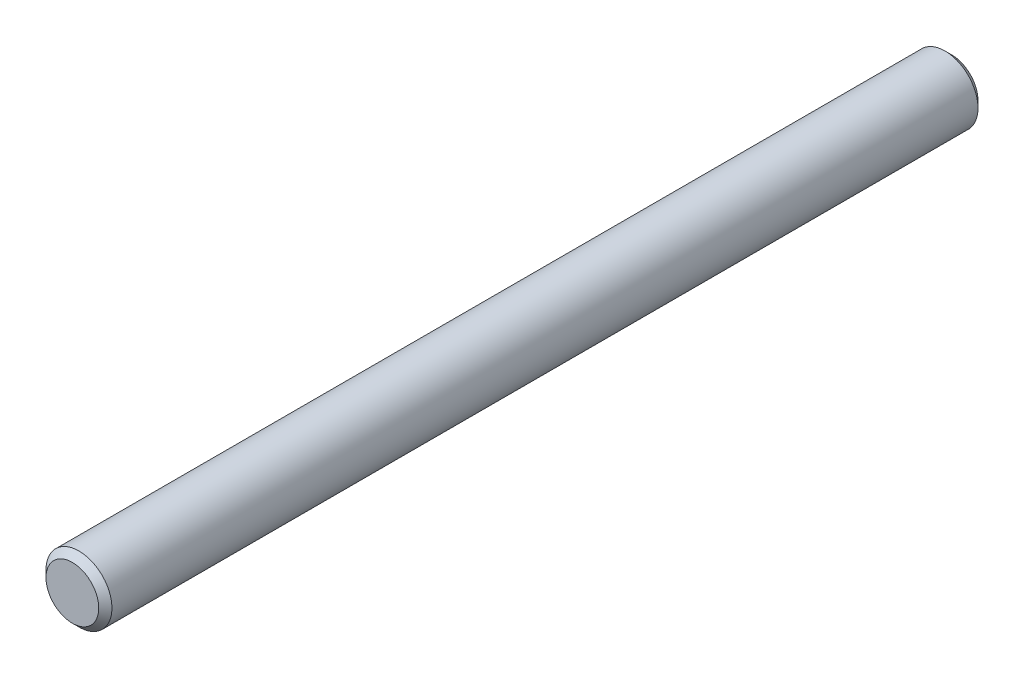
ISO-10303-21;
HEADER;
FILE_DESCRIPTION(('STEP AP214'),'2;1');
FILE_NAME('part.step','',(''),(''),'','','');
FILE_SCHEMA(('AUTOMOTIVE_DESIGN { 1 0 10303 214 1 1 1 1 }'));
ENDSEC;
DATA;
#1=APPLICATION_CONTEXT('core data for automotive mechanical design processes');
#2=APPLICATION_PROTOCOL_DEFINITION('international standard','automotive_design',2000,#1);
#3=PRODUCT_CONTEXT('',#1,'mechanical');
#4=PRODUCT('Part','Part','',(#3));
#5=PRODUCT_RELATED_PRODUCT_CATEGORY('part','',(#4));
#6=PRODUCT_DEFINITION_FORMATION('','',#4);
#7=PRODUCT_DEFINITION_CONTEXT('part definition',#1,'design');
#8=PRODUCT_DEFINITION('design','',#6,#7);
#9=PRODUCT_DEFINITION_SHAPE('','',#8);
#10=(LENGTH_UNIT() NAMED_UNIT(*) SI_UNIT(.MILLI.,.METRE.));
#11=(NAMED_UNIT(*) PLANE_ANGLE_UNIT() SI_UNIT($,.RADIAN.));
#12=(NAMED_UNIT(*) SI_UNIT($,.STERADIAN.) SOLID_ANGLE_UNIT());
#13=UNCERTAINTY_MEASURE_WITH_UNIT(LENGTH_MEASURE(1.E-05),#10,'distance_accuracy_value','');
#14=(GEOMETRIC_REPRESENTATION_CONTEXT(3) GLOBAL_UNCERTAINTY_ASSIGNED_CONTEXT((#13)) GLOBAL_UNIT_ASSIGNED_CONTEXT((#10,
#11,#12)) REPRESENTATION_CONTEXT('',''));
#15=CARTESIAN_POINT('',(0.,0.,0.));
#16=DIRECTION('',(0.,0.,1.));
#17=DIRECTION('',(1.,0.,0.));
#18=AXIS2_PLACEMENT_3D('',#15,#16,#17);
#19=CARTESIAN_POINT('',(0.,0.,63.5));
#20=DIRECTION('',(0.,0.,-1.));
#21=DIRECTION('',(-1.,0.,0.));
#22=AXIS2_PLACEMENT_3D('',#19,#20,#21);
#23=CYLINDRICAL_SURFACE('',#22,4.7625);
#24=CARTESIAN_POINT('',(0.,0.,-62.5475));
#25=DIRECTION('',(0.,0.,1.));
#26=DIRECTION('',(1.,0.,0.));
#27=AXIS2_PLACEMENT_3D('',#24,#25,#26);
#28=CIRCLE('',#27,4.7625);
#29=CARTESIAN_POINT('',(-4.7625,0.,-62.5475));
#30=VERTEX_POINT('',#29);
#31=EDGE_CURVE('E50',#30,#30,#28,.T.);
#32=CARTESIAN_POINT('',(0.,0.,62.5475));
#33=DIRECTION('',(0.,0.,1.));
#34=DIRECTION('',(1.,0.,0.));
#35=AXIS2_PLACEMENT_3D('',#32,#33,#34);
#36=CIRCLE('',#35,4.7625);
#37=CARTESIAN_POINT('',(-4.7625,0.,62.5475));
#38=VERTEX_POINT('',#37);
#39=EDGE_CURVE('E55',#38,#38,#36,.F.);
#40=CARTESIAN_POINT('',(-4.7625,0.,-62.5475));
#41=CARTESIAN_POINT('',(-4.7625,0.,-61.2444270833333));
#42=CARTESIAN_POINT('',(-4.7625,0.,-59.9413541666666));
#43=CARTESIAN_POINT('',(-4.7625,0.,-57.3352083333333));
#44=CARTESIAN_POINT('',(-4.7625,0.,-56.0321354166666));
#45=CARTESIAN_POINT('',(-4.7625,0.,-53.4259895833333));
#46=CARTESIAN_POINT('',(-4.7625,0.,-52.1229166666666));
#47=CARTESIAN_POINT('',(-4.7625,0.,-49.5167708333333));
#48=CARTESIAN_POINT('',(-4.7625,0.,-48.2136979166667));
#49=CARTESIAN_POINT('',(-4.7625,0.,-45.6075520833333));
#50=CARTESIAN_POINT('',(-4.7625,0.,-44.3044791666667));
#51=CARTESIAN_POINT('',(-4.7625,0.,-41.6983333333333));
#52=CARTESIAN_POINT('',(-4.7625,0.,-40.3952604166667));
#53=CARTESIAN_POINT('',(-4.7625,0.,-37.7891145833333));
#54=CARTESIAN_POINT('',(-4.7625,0.,-36.4860416666667));
#55=CARTESIAN_POINT('',(-4.7625,0.,-33.8798958333333));
#56=CARTESIAN_POINT('',(-4.7625,0.,-32.5768229166667));
#57=CARTESIAN_POINT('',(-4.7625,0.,-29.9706770833333));
#58=CARTESIAN_POINT('',(-4.7625,0.,-28.6676041666667));
#59=CARTESIAN_POINT('',(-4.7625,0.,-26.0614583333333));
#60=CARTESIAN_POINT('',(-4.7625,0.,-24.7583854166667));
#61=CARTESIAN_POINT('',(-4.7625,0.,-22.1522395833333));
#62=CARTESIAN_POINT('',(-4.7625,0.,-20.8491666666667));
#63=CARTESIAN_POINT('',(-4.7625,0.,-18.2430208333333));
#64=CARTESIAN_POINT('',(-4.7625,0.,-16.9399479166667));
#65=CARTESIAN_POINT('',(-4.7625,0.,-14.3338020833333));
#66=CARTESIAN_POINT('',(-4.7625,0.,-13.0307291666666));
#67=CARTESIAN_POINT('',(-4.7625,0.,-10.4245833333333));
#68=CARTESIAN_POINT('',(-4.7625,0.,-9.12151041666665));
#69=CARTESIAN_POINT('',(-4.7625,0.,-6.51536458333332));
#70=CARTESIAN_POINT('',(-4.7625,0.,-5.21229166666665));
#71=CARTESIAN_POINT('',(-4.7625,0.,-2.60614583333332));
#72=CARTESIAN_POINT('',(-4.7625,0.,-1.30307291666665));
#73=CARTESIAN_POINT('',(-4.7625,0.,1.30307291666668));
#74=CARTESIAN_POINT('',(-4.7625,0.,2.60614583333335));
#75=CARTESIAN_POINT('',(-4.7625,0.,5.21229166666668));
#76=CARTESIAN_POINT('',(-4.7625,0.,6.51536458333335));
#77=CARTESIAN_POINT('',(-4.7625,0.,9.12151041666668));
#78=CARTESIAN_POINT('',(-4.7625,0.,10.4245833333333));
#79=CARTESIAN_POINT('',(-4.7625,0.,13.0307291666667));
#80=CARTESIAN_POINT('',(-4.7625,0.,14.3338020833333));
#81=CARTESIAN_POINT('',(-4.7625,0.,16.9399479166667));
#82=CARTESIAN_POINT('',(-4.7625,0.,18.2430208333333));
#83=CARTESIAN_POINT('',(-4.7625,0.,20.8491666666667));
#84=CARTESIAN_POINT('',(-4.7625,0.,22.1522395833333));
#85=CARTESIAN_POINT('',(-4.7625,0.,24.7583854166667));
#86=CARTESIAN_POINT('',(-4.7625,0.,26.0614583333333));
#87=CARTESIAN_POINT('',(-4.7625,0.,28.6676041666667));
#88=CARTESIAN_POINT('',(-4.7625,0.,29.9706770833333));
#89=CARTESIAN_POINT('',(-4.7625,0.,32.5768229166667));
#90=CARTESIAN_POINT('',(-4.7625,0.,33.8798958333334));
#91=CARTESIAN_POINT('',(-4.7625,0.,36.4860416666667));
#92=CARTESIAN_POINT('',(-4.7625,0.,37.7891145833333));
#93=CARTESIAN_POINT('',(-4.7625,0.,40.3952604166667));
#94=CARTESIAN_POINT('',(-4.7625,0.,41.6983333333333));
#95=CARTESIAN_POINT('',(-4.7625,0.,44.3044791666667));
#96=CARTESIAN_POINT('',(-4.7625,0.,45.6075520833333));
#97=CARTESIAN_POINT('',(-4.7625,0.,48.2136979166667));
#98=CARTESIAN_POINT('',(-4.7625,0.,49.5167708333333));
#99=CARTESIAN_POINT('',(-4.7625,0.,52.1229166666667));
#100=CARTESIAN_POINT('',(-4.7625,0.,53.4259895833333));
#101=CARTESIAN_POINT('',(-4.7625,0.,56.0321354166667));
#102=CARTESIAN_POINT('',(-4.7625,0.,57.3352083333333));
#103=CARTESIAN_POINT('',(-4.7625,0.,59.9413541666667));
#104=CARTESIAN_POINT('',(-4.7625,0.,61.2444270833333));
#105=CARTESIAN_POINT('',(-4.7625,0.,62.5475));
#106=B_SPLINE_CURVE_WITH_KNOTS('',3,(#40,#41,#42,#43,#44,#45,#46,#47,#48,#49,#50,#51,#52,#53,
#54,#55,#56,#57,#58,#59,#60,#61,#62,#63,#64,#65,#66,#67,#68,#69,#70,#71,#72,#73,#74,#75,#76,#77,
#78,#79,#80,#81,#82,#83,#84,#85,#86,#87,#88,#89,#90,#91,#92,#93,#94,#95,#96,#97,#98,#99,#100,
#101,#102,#103,#104,#105),.UNSPECIFIED.,.F.,.F.,(4,2,2,2,2,2,2,2,2,2,2,2,2,2,2,2,2,2,2,2,2,2,2,
2,2,2,2,2,2,2,2,2,4),(0.,3.90921875,7.8184375,11.72765625,15.636875,19.54609375,23.4553125,
27.36453125,31.27375,35.18296875,39.0921875,43.00140625,46.910625,50.81984375,54.7290625,
58.63828125,62.5475,66.45671875,70.3659375,74.27515625,78.184375,82.09359375,86.0028125,
89.91203125,93.82125,97.73046875,101.6396875,105.54890625,109.458125,113.36734375,117.2765625,
121.18578125,125.095),.UNSPECIFIED.);
#107=EDGE_CURVE('BSEAM37',#30,#38,#106,.T.);
#108=ORIENTED_EDGE('',*,*,#31,.T.);
#109=ORIENTED_EDGE('',*,*,#39,.T.);
#110=ORIENTED_EDGE('',*,*,#107,.T.);
#111=ORIENTED_EDGE('',*,*,#107,.F.);
#112=EDGE_LOOP('',(#108,#110,#109,#111));
#113=FACE_BOUND('',#112,.T.);
#114=ADVANCED_FACE('F37',(#113),#23,.T.);
#115=CARTESIAN_POINT('',(0.,0.,63.5));
#116=DIRECTION('',(0.,0.,1.));
#117=DIRECTION('',(1.,0.,0.));
#118=AXIS2_PLACEMENT_3D('',#115,#116,#117);
#119=PLANE('',#118);
#120=CARTESIAN_POINT('',(0.,0.,63.5));
#121=DIRECTION('',(0.,0.,1.));
#122=DIRECTION('',(1.,0.,0.));
#123=AXIS2_PLACEMENT_3D('',#120,#121,#122);
#124=CIRCLE('',#123,3.81000000000002);
#125=CARTESIAN_POINT('',(-3.81000000000003,0.,63.5));
#126=VERTEX_POINT('',#125);
#127=EDGE_CURVE('E10',#126,#126,#124,.T.);
#128=ORIENTED_EDGE('',*,*,#127,.T.);
#129=EDGE_LOOP('',(#128));
#130=FACE_BOUND('',#129,.T.);
#131=ADVANCED_FACE('F72',(#130),#119,.T.);
#132=CARTESIAN_POINT('',(0.,0.,-63.5));
#133=DIRECTION('',(0.,0.,1.));
#134=DIRECTION('',(1.,0.,0.));
#135=AXIS2_PLACEMENT_3D('',#132,#133,#134);
#136=PLANE('',#135);
#137=CARTESIAN_POINT('',(0.,0.,-63.5));
#138=DIRECTION('',(0.,0.,1.));
#139=DIRECTION('',(1.,0.,0.));
#140=AXIS2_PLACEMENT_3D('',#137,#138,#139);
#141=CIRCLE('',#140,3.80999999999998);
#142=CARTESIAN_POINT('',(3.80999999999998,0.,-63.5));
#143=VERTEX_POINT('',#142);
#144=EDGE_CURVE('E45',#143,#143,#141,.F.);
#145=ORIENTED_EDGE('',*,*,#144,.T.);
#146=EDGE_LOOP('',(#145));
#147=FACE_BOUND('',#146,.T.);
#148=ADVANCED_FACE('F69',(#147),#136,.F.);
#149=CARTESIAN_POINT('',(0.,0.,-62.5475));
#150=DIRECTION('',(0.,0.,1.));
#151=DIRECTION('',(1.,0.,0.));
#152=AXIS2_PLACEMENT_3D('',#149,#150,#151);
#153=CONICAL_SURFACE('',#152,4.7625,0.785398163397447);
#154=ORIENTED_EDGE('',*,*,#144,.F.);
#155=EDGE_LOOP('',(#154));
#156=FACE_BOUND('',#155,.T.);
#157=ORIENTED_EDGE('',*,*,#31,.F.);
#158=EDGE_LOOP('',(#157));
#159=FACE_BOUND('',#158,.T.);
#160=ADVANCED_FACE('F65',(#156,#159),#153,.T.);
#161=CARTESIAN_POINT('',(0.,0.,63.5));
#162=DIRECTION('',(0.,0.,-1.));
#163=DIRECTION('',(-1.,0.,0.));
#164=AXIS2_PLACEMENT_3D('',#161,#162,#163);
#165=CONICAL_SURFACE('',#164,3.81000000000002,0.785398163397447);
#166=CARTESIAN_POINT('',(-4.76250000000001,0.,62.5475));
#167=CARTESIAN_POINT('',(-4.75257812500001,0.,62.557421875));
#168=CARTESIAN_POINT('',(-4.74265625000001,0.,62.56734375));
#169=CARTESIAN_POINT('',(-4.72281250000001,0.,62.5871875));
#170=CARTESIAN_POINT('',(-4.71289062500001,0.,62.597109375));
#171=CARTESIAN_POINT('',(-4.69304687500001,0.,62.616953125));
#172=CARTESIAN_POINT('',(-4.68312500000001,0.,62.626875));
#173=CARTESIAN_POINT('',(-4.66328125000001,0.,62.64671875));
#174=CARTESIAN_POINT('',(-4.65335937500001,0.,62.656640625));
#175=CARTESIAN_POINT('',(-4.63351562500001,0.,62.676484375));
#176=CARTESIAN_POINT('',(-4.62359375000001,0.,62.68640625));
#177=CARTESIAN_POINT('',(-4.60375000000001,0.,62.70625));
#178=CARTESIAN_POINT('',(-4.59382812500001,0.,62.716171875));
#179=CARTESIAN_POINT('',(-4.57398437500001,0.,62.736015625));
#180=CARTESIAN_POINT('',(-4.56406250000001,0.,62.7459375));
#181=CARTESIAN_POINT('',(-4.54421875000001,0.,62.76578125));
#182=CARTESIAN_POINT('',(-4.53429687500001,0.,62.775703125));
#183=CARTESIAN_POINT('',(-4.51445312500001,0.,62.795546875));
#184=CARTESIAN_POINT('',(-4.50453125000001,0.,62.80546875));
#185=CARTESIAN_POINT('',(-4.48468750000001,0.,62.8253125));
#186=CARTESIAN_POINT('',(-4.47476562500001,0.,62.835234375));
#187=CARTESIAN_POINT('',(-4.45492187500001,0.,62.855078125));
#188=CARTESIAN_POINT('',(-4.44500000000001,0.,62.865));
#189=CARTESIAN_POINT('',(-4.42515625000001,0.,62.88484375));
#190=CARTESIAN_POINT('',(-4.41523437500001,0.,62.894765625));
#191=CARTESIAN_POINT('',(-4.39539062500001,0.,62.914609375));
#192=CARTESIAN_POINT('',(-4.38546875000002,0.,62.92453125));
#193=CARTESIAN_POINT('',(-4.36562500000002,0.,62.944375));
#194=CARTESIAN_POINT('',(-4.35570312500002,0.,62.954296875));
#195=CARTESIAN_POINT('',(-4.33585937500002,0.,62.974140625));
#196=CARTESIAN_POINT('',(-4.32593750000002,0.,62.9840625));
#197=CARTESIAN_POINT('',(-4.30609375000002,0.,63.00390625));
#198=CARTESIAN_POINT('',(-4.29617187500002,0.,63.013828125));
#199=CARTESIAN_POINT('',(-4.27632812500002,0.,63.033671875));
#200=CARTESIAN_POINT('',(-4.26640625000002,0.,63.04359375));
#201=CARTESIAN_POINT('',(-4.24656250000002,0.,63.0634375));
#202=CARTESIAN_POINT('',(-4.23664062500002,0.,63.073359375));
#203=CARTESIAN_POINT('',(-4.21679687500002,0.,63.093203125));
#204=CARTESIAN_POINT('',(-4.20687500000002,0.,63.103125));
#205=CARTESIAN_POINT('',(-4.18703125000002,0.,63.12296875));
#206=CARTESIAN_POINT('',(-4.17710937500002,0.,63.132890625));
#207=CARTESIAN_POINT('',(-4.15726562500002,0.,63.152734375));
#208=CARTESIAN_POINT('',(-4.14734375000002,0.,63.16265625));
#209=CARTESIAN_POINT('',(-4.12750000000002,0.,63.1825));
#210=CARTESIAN_POINT('',(-4.11757812500002,0.,63.192421875));
#211=CARTESIAN_POINT('',(-4.09773437500002,0.,63.212265625));
#212=CARTESIAN_POINT('',(-4.08781250000002,0.,63.2221875));
#213=CARTESIAN_POINT('',(-4.06796875000002,0.,63.24203125));
#214=CARTESIAN_POINT('',(-4.05804687500002,0.,63.251953125));
#215=CARTESIAN_POINT('',(-4.03820312500002,0.,63.271796875));
#216=CARTESIAN_POINT('',(-4.02828125000002,0.,63.28171875));
#217=CARTESIAN_POINT('',(-4.00843750000002,0.,63.3015625));
#218=CARTESIAN_POINT('',(-3.99851562500002,0.,63.311484375));
#219=CARTESIAN_POINT('',(-3.97867187500003,0.,63.331328125));
#220=CARTESIAN_POINT('',(-3.96875000000003,0.,63.34125));
#221=CARTESIAN_POINT('',(-3.94890625000003,0.,63.36109375));
#222=CARTESIAN_POINT('',(-3.93898437500003,0.,63.371015625));
#223=CARTESIAN_POINT('',(-3.91914062500003,0.,63.390859375));
#224=CARTESIAN_POINT('',(-3.90921875000003,0.,63.40078125));
#225=CARTESIAN_POINT('',(-3.88937500000003,0.,63.420625));
#226=CARTESIAN_POINT('',(-3.87945312500003,0.,63.430546875));
#227=CARTESIAN_POINT('',(-3.85960937500003,0.,63.450390625));
#228=CARTESIAN_POINT('',(-3.84968750000003,0.,63.4603125));
#229=CARTESIAN_POINT('',(-3.82984375000003,0.,63.48015625));
#230=CARTESIAN_POINT('',(-3.81992187500003,0.,63.490078125));
#231=CARTESIAN_POINT('',(-3.81000000000003,0.,63.5));
#232=B_SPLINE_CURVE_WITH_KNOTS('',3,(#166,#167,#168,#169,#170,#171,#172,#173,#174,#175,#176,
#177,#178,#179,#180,#181,#182,#183,#184,#185,#186,#187,#188,#189,#190,#191,#192,#193,#194,#195,
#196,#197,#198,#199,#200,#201,#202,#203,#204,#205,#206,#207,#208,#209,#210,#211,#212,#213,#214,
#215,#216,#217,#218,#219,#220,#221,#222,#223,#224,#225,#226,#227,#228,#229,#230,#231),
.UNSPECIFIED.,.F.,.F.,(4,2,2,2,2,2,2,2,2,2,2,2,2,2,2,2,2,2,2,2,2,2,2,2,2,2,2,2,2,2,2,2,4),(0.,
0.042094950567509,0.0841899011350186,0.126284851702528,0.168379802270037,0.210474752837546,
0.252569703405055,0.294664653972575,0.336759604540084,0.378854555107593,0.420949505675102,
0.463044456242611,0.50513940681012,0.547234357377639,0.589329307945148,0.631424258512658,
0.673519209080167,0.715614159647676,0.757709110215185,0.799804060782694,0.841899011350214,
0.883993961917723,0.926088912485232,0.968183863052741,1.01027881362025,1.05237376418776,
1.09446871475528,1.13656366532279,1.1786586158903,1.22075356645781,1.26284851702531,
1.30494346759282,1.34703841816034),.UNSPECIFIED.);
#233=EDGE_CURVE('BSEAM39',#38,#126,#232,.T.);
#234=ORIENTED_EDGE('',*,*,#39,.F.);
#235=ORIENTED_EDGE('',*,*,#127,.F.);
#236=ORIENTED_EDGE('',*,*,#233,.T.);
#237=ORIENTED_EDGE('',*,*,#233,.F.);
#238=EDGE_LOOP('',(#234,#236,#235,#237));
#239=FACE_BOUND('',#238,.T.);
#240=ADVANCED_FACE('F39',(#239),#165,.T.);
#241=CLOSED_SHELL('',(#114,#131,#148,#160,#240));
#242=MANIFOLD_SOLID_BREP('B2',#241);
#243=ADVANCED_BREP_SHAPE_REPRESENTATION('',(#18,#242),#14);
#244=SHAPE_DEFINITION_REPRESENTATION(#9,#243);
ENDSEC;
END-ISO-10303-21;
